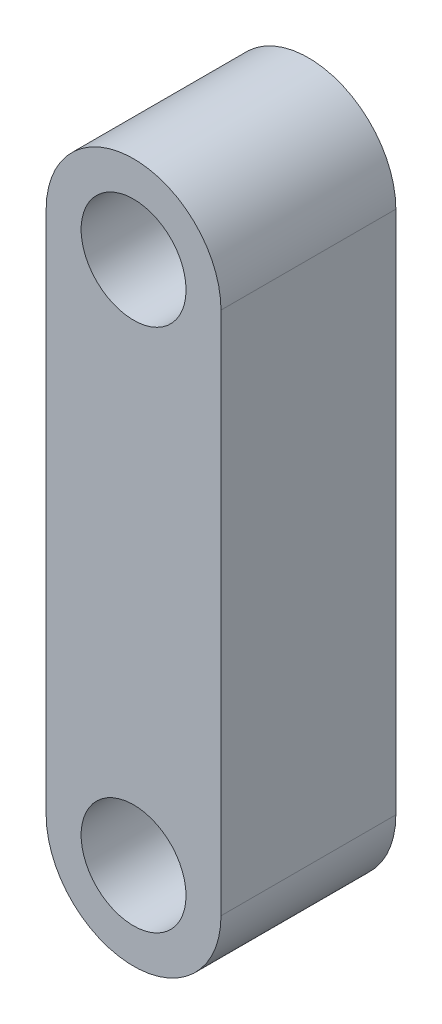
ISO-10303-21;
HEADER;
FILE_DESCRIPTION(('STEP AP214'),'2;1');
FILE_NAME('part.step','',(''),(''),'','','');
FILE_SCHEMA(('AUTOMOTIVE_DESIGN { 1 0 10303 214 1 1 1 1 }'));
ENDSEC;
DATA;
#1=APPLICATION_CONTEXT('core data for automotive mechanical design processes');
#2=APPLICATION_PROTOCOL_DEFINITION('international standard','automotive_design',2000,#1);
#3=PRODUCT_CONTEXT('',#1,'mechanical');
#4=PRODUCT('Part','Part','',(#3));
#5=PRODUCT_RELATED_PRODUCT_CATEGORY('part','',(#4));
#6=PRODUCT_DEFINITION_FORMATION('','',#4);
#7=PRODUCT_DEFINITION_CONTEXT('part definition',#1,'design');
#8=PRODUCT_DEFINITION('design','',#6,#7);
#9=PRODUCT_DEFINITION_SHAPE('','',#8);
#10=(LENGTH_UNIT() NAMED_UNIT(*) SI_UNIT(.MILLI.,.METRE.));
#11=(NAMED_UNIT(*) PLANE_ANGLE_UNIT() SI_UNIT($,.RADIAN.));
#12=(NAMED_UNIT(*) SI_UNIT($,.STERADIAN.) SOLID_ANGLE_UNIT());
#13=UNCERTAINTY_MEASURE_WITH_UNIT(LENGTH_MEASURE(1.E-05),#10,'distance_accuracy_value','');
#14=(GEOMETRIC_REPRESENTATION_CONTEXT(3) GLOBAL_UNCERTAINTY_ASSIGNED_CONTEXT((#13)) GLOBAL_UNIT_ASSIGNED_CONTEXT((#10,
#11,#12)) REPRESENTATION_CONTEXT('',''));
#15=CARTESIAN_POINT('',(0.,0.,0.));
#16=DIRECTION('',(0.,0.,1.));
#17=DIRECTION('',(1.,0.,0.));
#18=AXIS2_PLACEMENT_3D('',#15,#16,#17);
#19=CARTESIAN_POINT('',(0.,0.,5.));
#20=DIRECTION('',(0.,0.,-1.));
#21=DIRECTION('',(-1.,0.,0.));
#22=AXIS2_PLACEMENT_3D('',#19,#20,#21);
#23=CYLINDRICAL_SURFACE('',#22,2.5);
#24=CARTESIAN_POINT('',(0.,0.,0.));
#25=DIRECTION('',(0.,0.,1.));
#26=DIRECTION('',(1.,0.,0.));
#27=AXIS2_PLACEMENT_3D('',#24,#25,#26);
#28=CIRCLE('',#27,2.5);
#29=CARTESIAN_POINT('',(-2.5,0.,0.));
#30=VERTEX_POINT('',#29);
#31=CARTESIAN_POINT('',(2.5,0.,0.));
#32=VERTEX_POINT('',#31);
#33=EDGE_CURVE('E107',#30,#32,#28,.T.);
#34=ORIENTED_EDGE('',*,*,#33,.T.);
#35=DIRECTION('',(0.,0.,-1.));
#36=VECTOR('',#35,1.);
#37=CARTESIAN_POINT('',(2.5,0.,5.));
#38=LINE('',#37,#36);
#39=CARTESIAN_POINT('',(2.5,0.,5.));
#40=VERTEX_POINT('',#39);
#41=EDGE_CURVE('E11',#40,#32,#38,.T.);
#42=ORIENTED_EDGE('',*,*,#41,.F.);
#43=CARTESIAN_POINT('',(0.,0.,5.));
#44=DIRECTION('',(0.,0.,1.));
#45=DIRECTION('',(1.,0.,0.));
#46=AXIS2_PLACEMENT_3D('',#43,#44,#45);
#47=CIRCLE('',#46,2.5);
#48=CARTESIAN_POINT('',(-2.5,0.,5.));
#49=VERTEX_POINT('',#48);
#50=EDGE_CURVE('E87',#49,#40,#47,.T.);
#51=ORIENTED_EDGE('',*,*,#50,.F.);
#52=DIRECTION('',(0.,0.,-1.));
#53=VECTOR('',#52,1.);
#54=CARTESIAN_POINT('',(-2.5,0.,5.));
#55=LINE('',#54,#53);
#56=EDGE_CURVE('E53',#49,#30,#55,.T.);
#57=ORIENTED_EDGE('',*,*,#56,.T.);
#58=EDGE_LOOP('',(#34,#42,#51,#57));
#59=FACE_BOUND('',#58,.T.);
#60=ADVANCED_FACE('F37',(#59),#23,.T.);
#61=CARTESIAN_POINT('',(2.5,0.,5.));
#62=DIRECTION('',(-1.,0.,0.));
#63=DIRECTION('',(0.,-1.,0.));
#64=AXIS2_PLACEMENT_3D('',#61,#62,#63);
#65=PLANE('',#64);
#66=DIRECTION('',(0.,1.,0.));
#67=VECTOR('',#66,1.);
#68=CARTESIAN_POINT('',(2.5,0.,0.));
#69=LINE('',#68,#67);
#70=CARTESIAN_POINT('',(2.5,15.,0.));
#71=VERTEX_POINT('',#70);
#72=EDGE_CURVE('E92',#32,#71,#69,.T.);
#73=ORIENTED_EDGE('',*,*,#72,.T.);
#74=DIRECTION('',(0.,0.,-1.));
#75=VECTOR('',#74,1.);
#76=CARTESIAN_POINT('',(2.5,15.,5.));
#77=LINE('',#76,#75);
#78=CARTESIAN_POINT('',(2.5,15.,5.));
#79=VERTEX_POINT('',#78);
#80=EDGE_CURVE('E45',#79,#71,#77,.T.);
#81=ORIENTED_EDGE('',*,*,#80,.F.);
#82=DIRECTION('',(0.,1.,0.));
#83=VECTOR('',#82,1.);
#84=CARTESIAN_POINT('',(2.5,0.,5.));
#85=LINE('',#84,#83);
#86=EDGE_CURVE('E79',#40,#79,#85,.T.);
#87=ORIENTED_EDGE('',*,*,#86,.F.);
#88=ORIENTED_EDGE('',*,*,#41,.T.);
#89=EDGE_LOOP('',(#73,#81,#87,#88));
#90=FACE_BOUND('',#89,.T.);
#91=ADVANCED_FACE('F91',(#90),#65,.F.);
#92=CARTESIAN_POINT('',(0.,15.,5.));
#93=DIRECTION('',(0.,0.,-1.));
#94=DIRECTION('',(-1.,0.,0.));
#95=AXIS2_PLACEMENT_3D('',#92,#93,#94);
#96=CYLINDRICAL_SURFACE('',#95,2.5);
#97=CARTESIAN_POINT('',(0.,15.,0.));
#98=DIRECTION('',(0.,0.,1.));
#99=DIRECTION('',(1.,0.,0.));
#100=AXIS2_PLACEMENT_3D('',#97,#98,#99);
#101=CIRCLE('',#100,2.5);
#102=CARTESIAN_POINT('',(-2.5,15.,0.));
#103=VERTEX_POINT('',#102);
#104=EDGE_CURVE('E110',#71,#103,#101,.T.);
#105=ORIENTED_EDGE('',*,*,#104,.T.);
#106=DIRECTION('',(0.,0.,-1.));
#107=VECTOR('',#106,1.);
#108=CARTESIAN_POINT('',(-2.5,15.,5.));
#109=LINE('',#108,#107);
#110=CARTESIAN_POINT('',(-2.5,15.,5.));
#111=VERTEX_POINT('',#110);
#112=EDGE_CURVE('E68',#111,#103,#109,.T.);
#113=ORIENTED_EDGE('',*,*,#112,.F.);
#114=CARTESIAN_POINT('',(0.,15.,5.));
#115=DIRECTION('',(0.,0.,1.));
#116=DIRECTION('',(1.,0.,0.));
#117=AXIS2_PLACEMENT_3D('',#114,#115,#116);
#118=CIRCLE('',#117,2.5);
#119=EDGE_CURVE('E86',#79,#111,#118,.T.);
#120=ORIENTED_EDGE('',*,*,#119,.F.);
#121=ORIENTED_EDGE('',*,*,#80,.T.);
#122=EDGE_LOOP('',(#105,#113,#120,#121));
#123=FACE_BOUND('',#122,.T.);
#124=ADVANCED_FACE('F95',(#123),#96,.T.);
#125=CARTESIAN_POINT('',(0.,0.,5.));
#126=DIRECTION('',(0.,0.,-1.));
#127=DIRECTION('',(-1.,0.,0.));
#128=AXIS2_PLACEMENT_3D('',#125,#126,#127);
#129=CYLINDRICAL_SURFACE('',#128,1.5);
#130=CARTESIAN_POINT('',(0.,0.,5.));
#131=DIRECTION('',(0.,0.,1.));
#132=DIRECTION('',(1.,0.,0.));
#133=AXIS2_PLACEMENT_3D('',#130,#131,#132);
#134=CIRCLE('',#133,1.5);
#135=CARTESIAN_POINT('',(1.5,0.,5.));
#136=VERTEX_POINT('',#135);
#137=EDGE_CURVE('E98',#136,#136,#134,.T.);
#138=ORIENTED_EDGE('',*,*,#137,.T.);
#139=EDGE_LOOP('',(#138));
#140=FACE_BOUND('',#139,.T.);
#141=CARTESIAN_POINT('',(0.,0.,0.));
#142=DIRECTION('',(0.,0.,1.));
#143=DIRECTION('',(1.,0.,0.));
#144=AXIS2_PLACEMENT_3D('',#141,#142,#143);
#145=CIRCLE('',#144,1.5);
#146=CARTESIAN_POINT('',(1.5,0.,0.));
#147=VERTEX_POINT('',#146);
#148=EDGE_CURVE('E115',#147,#147,#145,.T.);
#149=ORIENTED_EDGE('',*,*,#148,.F.);
#150=EDGE_LOOP('',(#149));
#151=FACE_BOUND('',#150,.T.);
#152=ADVANCED_FACE('F136',(#140,#151),#129,.F.);
#153=CARTESIAN_POINT('',(-2.5,0.,5.));
#154=DIRECTION('',(-1.,0.,0.));
#155=DIRECTION('',(0.,-1.,0.));
#156=AXIS2_PLACEMENT_3D('',#153,#154,#155);
#157=PLANE('',#156);
#158=DIRECTION('',(0.,1.,0.));
#159=VECTOR('',#158,1.);
#160=CARTESIAN_POINT('',(-2.5,0.,0.));
#161=LINE('',#160,#159);
#162=EDGE_CURVE('E112',#30,#103,#161,.T.);
#163=ORIENTED_EDGE('',*,*,#162,.F.);
#164=ORIENTED_EDGE('',*,*,#56,.F.);
#165=DIRECTION('',(0.,1.,0.));
#166=VECTOR('',#165,1.);
#167=CARTESIAN_POINT('',(-2.5,0.,5.));
#168=LINE('',#167,#166);
#169=EDGE_CURVE('E96',#49,#111,#168,.T.);
#170=ORIENTED_EDGE('',*,*,#169,.T.);
#171=ORIENTED_EDGE('',*,*,#112,.T.);
#172=EDGE_LOOP('',(#163,#164,#170,#171));
#173=FACE_BOUND('',#172,.T.);
#174=ADVANCED_FACE('F128',(#173),#157,.T.);
#175=CARTESIAN_POINT('',(0.,15.,5.));
#176=DIRECTION('',(0.,0.,-1.));
#177=DIRECTION('',(-1.,0.,0.));
#178=AXIS2_PLACEMENT_3D('',#175,#176,#177);
#179=CYLINDRICAL_SURFACE('',#178,1.5);
#180=CARTESIAN_POINT('',(0.,15.,5.));
#181=DIRECTION('',(0.,0.,1.));
#182=DIRECTION('',(1.,0.,0.));
#183=AXIS2_PLACEMENT_3D('',#180,#181,#182);
#184=CIRCLE('',#183,1.5);
#185=CARTESIAN_POINT('',(1.5,15.,5.));
#186=VERTEX_POINT('',#185);
#187=EDGE_CURVE('E104',#186,#186,#184,.T.);
#188=ORIENTED_EDGE('',*,*,#187,.T.);
#189=EDGE_LOOP('',(#188));
#190=FACE_BOUND('',#189,.T.);
#191=CARTESIAN_POINT('',(0.,15.,0.));
#192=DIRECTION('',(0.,0.,1.));
#193=DIRECTION('',(1.,0.,0.));
#194=AXIS2_PLACEMENT_3D('',#191,#192,#193);
#195=CIRCLE('',#194,1.5);
#196=CARTESIAN_POINT('',(1.5,15.,0.));
#197=VERTEX_POINT('',#196);
#198=EDGE_CURVE('E118',#197,#197,#195,.T.);
#199=ORIENTED_EDGE('',*,*,#198,.F.);
#200=EDGE_LOOP('',(#199));
#201=FACE_BOUND('',#200,.T.);
#202=ADVANCED_FACE('F126',(#190,#201),#179,.F.);
#203=CARTESIAN_POINT('',(0.,0.,5.));
#204=DIRECTION('',(0.,0.,1.));
#205=DIRECTION('',(1.,0.,0.));
#206=AXIS2_PLACEMENT_3D('',#203,#204,#205);
#207=PLANE('',#206);
#208=ORIENTED_EDGE('',*,*,#50,.T.);
#209=ORIENTED_EDGE('',*,*,#86,.T.);
#210=ORIENTED_EDGE('',*,*,#119,.T.);
#211=ORIENTED_EDGE('',*,*,#169,.F.);
#212=EDGE_LOOP('',(#208,#209,#210,#211));
#213=FACE_BOUND('',#212,.T.);
#214=ORIENTED_EDGE('',*,*,#137,.F.);
#215=EDGE_LOOP('',(#214));
#216=FACE_BOUND('',#215,.T.);
#217=ORIENTED_EDGE('',*,*,#187,.F.);
#218=EDGE_LOOP('',(#217));
#219=FACE_BOUND('',#218,.T.);
#220=ADVANCED_FACE('F82',(#213,#216,#219),#207,.T.);
#221=CARTESIAN_POINT('',(0.,0.,0.));
#222=DIRECTION('',(0.,0.,1.));
#223=DIRECTION('',(1.,0.,0.));
#224=AXIS2_PLACEMENT_3D('',#221,#222,#223);
#225=PLANE('',#224);
#226=ORIENTED_EDGE('',*,*,#33,.F.);
#227=ORIENTED_EDGE('',*,*,#162,.T.);
#228=ORIENTED_EDGE('',*,*,#104,.F.);
#229=ORIENTED_EDGE('',*,*,#72,.F.);
#230=EDGE_LOOP('',(#226,#227,#228,#229));
#231=FACE_BOUND('',#230,.T.);
#232=ORIENTED_EDGE('',*,*,#148,.T.);
#233=EDGE_LOOP('',(#232));
#234=FACE_BOUND('',#233,.T.);
#235=ORIENTED_EDGE('',*,*,#198,.T.);
#236=EDGE_LOOP('',(#235));
#237=FACE_BOUND('',#236,.T.);
#238=ADVANCED_FACE('F124',(#231,#234,#237),#225,.F.);
#239=CLOSED_SHELL('',(#60,#91,#124,#152,#174,#202,#220,#238));
#240=MANIFOLD_SOLID_BREP('B2',#239);
#241=ADVANCED_BREP_SHAPE_REPRESENTATION('',(#18,#240),#14);
#242=SHAPE_DEFINITION_REPRESENTATION(#9,#241);
ENDSEC;
END-ISO-10303-21;
